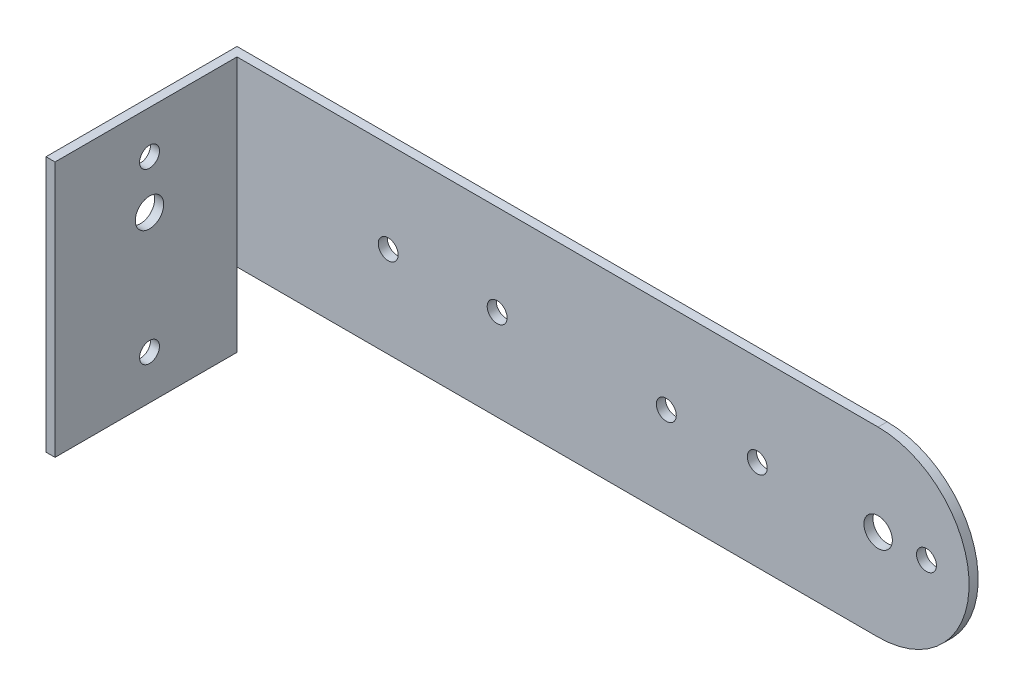
ISO-10303-21;
HEADER;
FILE_DESCRIPTION(('STEP AP214'),'2;1');
FILE_NAME('part.step','',(''),(''),'','','');
FILE_SCHEMA(('AUTOMOTIVE_DESIGN { 1 0 10303 214 1 1 1 1 }'));
ENDSEC;
DATA;
#1=APPLICATION_CONTEXT('core data for automotive mechanical design processes');
#2=APPLICATION_PROTOCOL_DEFINITION('international standard','automotive_design',2000,#1);
#3=PRODUCT_CONTEXT('',#1,'mechanical');
#4=PRODUCT('Part','Part','',(#3));
#5=PRODUCT_RELATED_PRODUCT_CATEGORY('part','',(#4));
#6=PRODUCT_DEFINITION_FORMATION('','',#4);
#7=PRODUCT_DEFINITION_CONTEXT('part definition',#1,'design');
#8=PRODUCT_DEFINITION('design','',#6,#7);
#9=PRODUCT_DEFINITION_SHAPE('','',#8);
#10=(LENGTH_UNIT() NAMED_UNIT(*) SI_UNIT(.MILLI.,.METRE.));
#11=(NAMED_UNIT(*) PLANE_ANGLE_UNIT() SI_UNIT($,.RADIAN.));
#12=(NAMED_UNIT(*) SI_UNIT($,.STERADIAN.) SOLID_ANGLE_UNIT());
#13=UNCERTAINTY_MEASURE_WITH_UNIT(LENGTH_MEASURE(1.E-05),#10,'distance_accuracy_value','');
#14=(GEOMETRIC_REPRESENTATION_CONTEXT(3) GLOBAL_UNCERTAINTY_ASSIGNED_CONTEXT((#13)) GLOBAL_UNIT_ASSIGNED_CONTEXT((#10,
#11,#12)) REPRESENTATION_CONTEXT('',''));
#15=CARTESIAN_POINT('',(0.,0.,0.));
#16=DIRECTION('',(0.,0.,1.));
#17=DIRECTION('',(1.,0.,0.));
#18=AXIS2_PLACEMENT_3D('',#15,#16,#17);
#19=CARTESIAN_POINT('',(0.,0.,1.59));
#20=DIRECTION('',(0.,0.,-1.));
#21=DIRECTION('',(-1.,0.,0.));
#22=AXIS2_PLACEMENT_3D('',#19,#20,#21);
#23=CYLINDRICAL_SURFACE('',#22,16.);
#24=CARTESIAN_POINT('',(0.,0.,0.));
#25=DIRECTION('',(0.,0.,1.));
#26=DIRECTION('',(1.,0.,0.));
#27=AXIS2_PLACEMENT_3D('',#24,#25,#26);
#28=CIRCLE('',#27,16.);
#29=CARTESIAN_POINT('',(0.,-16.,0.));
#30=VERTEX_POINT('',#29);
#31=CARTESIAN_POINT('',(0.,16.,0.));
#32=VERTEX_POINT('',#31);
#33=EDGE_CURVE('E140',#30,#32,#28,.T.);
#34=ORIENTED_EDGE('',*,*,#33,.T.);
#35=DIRECTION('',(0.,0.,-1.));
#36=VECTOR('',#35,1.);
#37=CARTESIAN_POINT('',(0.,16.,1.59));
#38=LINE('',#37,#36);
#39=CARTESIAN_POINT('',(0.,16.,1.59));
#40=VERTEX_POINT('',#39);
#41=EDGE_CURVE('E54',#40,#32,#38,.T.);
#42=ORIENTED_EDGE('',*,*,#41,.F.);
#43=CARTESIAN_POINT('',(0.,0.,1.59));
#44=DIRECTION('',(0.,0.,1.));
#45=DIRECTION('',(1.,0.,0.));
#46=AXIS2_PLACEMENT_3D('',#43,#44,#45);
#47=CIRCLE('',#46,16.);
#48=CARTESIAN_POINT('',(0.,-16.,1.59));
#49=VERTEX_POINT('',#48);
#50=EDGE_CURVE('E149',#49,#40,#47,.T.);
#51=ORIENTED_EDGE('',*,*,#50,.F.);
#52=DIRECTION('',(0.,0.,-1.));
#53=VECTOR('',#52,1.);
#54=CARTESIAN_POINT('',(0.,-16.,1.59));
#55=LINE('',#54,#53);
#56=EDGE_CURVE('E154',#49,#30,#55,.T.);
#57=ORIENTED_EDGE('',*,*,#56,.T.);
#58=EDGE_LOOP('',(#34,#42,#51,#57));
#59=FACE_BOUND('',#58,.T.);
#60=ADVANCED_FACE('F46',(#59),#23,.T.);
#61=CARTESIAN_POINT('',(0.,16.,1.59));
#62=DIRECTION('',(0.,-1.,0.));
#63=DIRECTION('',(0.,0.,-1.));
#64=AXIS2_PLACEMENT_3D('',#61,#62,#63);
#65=PLANE('',#64);
#66=DIRECTION('',(-1.,0.,0.));
#67=VECTOR('',#66,1.);
#68=CARTESIAN_POINT('',(0.,16.,0.));
#69=LINE('',#68,#67);
#70=CARTESIAN_POINT('',(-114.34,16.,0.));
#71=VERTEX_POINT('',#70);
#72=EDGE_CURVE('E143',#32,#71,#69,.T.);
#73=ORIENTED_EDGE('',*,*,#72,.T.);
#74=DIRECTION('',(0.,0.,-1.));
#75=VECTOR('',#74,1.);
#76=CARTESIAN_POINT('',(-114.34,16.,1.59));
#77=LINE('',#76,#75);
#78=CARTESIAN_POINT('',(-114.34,16.,33.59));
#79=VERTEX_POINT('',#78);
#80=EDGE_CURVE('E163',#79,#71,#77,.T.);
#81=ORIENTED_EDGE('',*,*,#80,.F.);
#82=DIRECTION('',(-1.,0.,0.));
#83=VECTOR('',#82,1.);
#84=CARTESIAN_POINT('',(-114.34,16.,33.59));
#85=LINE('',#84,#83);
#86=CARTESIAN_POINT('',(-112.75,16.,33.59));
#87=VERTEX_POINT('',#86);
#88=EDGE_CURVE('E132',#87,#79,#85,.T.);
#89=ORIENTED_EDGE('',*,*,#88,.F.);
#90=DIRECTION('',(0.,0.,-1.));
#91=VECTOR('',#90,1.);
#92=CARTESIAN_POINT('',(-112.75,16.,33.59));
#93=LINE('',#92,#91);
#94=CARTESIAN_POINT('',(-112.75,16.,1.59));
#95=VERTEX_POINT('',#94);
#96=EDGE_CURVE('E145',#87,#95,#93,.T.);
#97=ORIENTED_EDGE('',*,*,#96,.T.);
#98=DIRECTION('',(-1.,0.,0.));
#99=VECTOR('',#98,1.);
#100=CARTESIAN_POINT('',(0.,16.,1.59));
#101=LINE('',#100,#99);
#102=EDGE_CURVE('E93',#40,#95,#101,.T.);
#103=ORIENTED_EDGE('',*,*,#102,.F.);
#104=ORIENTED_EDGE('',*,*,#41,.T.);
#105=EDGE_LOOP('',(#73,#81,#89,#97,#103,#104));
#106=FACE_BOUND('',#105,.T.);
#107=ADVANCED_FACE('F227',(#106),#65,.F.);
#108=CARTESIAN_POINT('',(-114.34,16.,1.59));
#109=DIRECTION('',(1.,0.,0.));
#110=DIRECTION('',(0.,0.,-1.));
#111=AXIS2_PLACEMENT_3D('',#108,#109,#110);
#112=PLANE('',#111);
#113=CARTESIAN_POINT('',(-114.34,8.5,16.975));
#114=DIRECTION('',(-1.,0.,0.));
#115=DIRECTION('',(0.,0.,1.));
#116=AXIS2_PLACEMENT_3D('',#113,#114,#115);
#117=CIRCLE('',#116,1.75);
#118=CARTESIAN_POINT('',(-114.34,8.5,18.725));
#119=VERTEX_POINT('',#118);
#120=EDGE_CURVE('E172',#119,#119,#117,.T.);
#121=ORIENTED_EDGE('',*,*,#120,.F.);
#122=EDGE_LOOP('',(#121));
#123=FACE_BOUND('',#122,.T.);
#124=CARTESIAN_POINT('',(-114.34,-21.25,16.975));
#125=DIRECTION('',(-1.,0.,0.));
#126=DIRECTION('',(0.,0.,1.));
#127=AXIS2_PLACEMENT_3D('',#124,#125,#126);
#128=CIRCLE('',#127,1.75);
#129=CARTESIAN_POINT('',(-114.34,-21.25,18.725));
#130=VERTEX_POINT('',#129);
#131=EDGE_CURVE('E177',#130,#130,#128,.T.);
#132=ORIENTED_EDGE('',*,*,#131,.F.);
#133=EDGE_LOOP('',(#132));
#134=FACE_BOUND('',#133,.T.);
#135=CARTESIAN_POINT('',(-114.34,0.,16.975));
#136=DIRECTION('',(-1.,0.,0.));
#137=DIRECTION('',(0.,0.,1.));
#138=AXIS2_PLACEMENT_3D('',#135,#136,#137);
#139=CIRCLE('',#138,2.5);
#140=CARTESIAN_POINT('',(-114.34,0.,19.475));
#141=VERTEX_POINT('',#140);
#142=EDGE_CURVE('E169',#141,#141,#139,.T.);
#143=ORIENTED_EDGE('',*,*,#142,.F.);
#144=EDGE_LOOP('',(#143));
#145=FACE_BOUND('',#144,.T.);
#146=DIRECTION('',(0.,-1.,0.));
#147=VECTOR('',#146,1.);
#148=CARTESIAN_POINT('',(-114.34,16.,0.));
#149=LINE('',#148,#147);
#150=CARTESIAN_POINT('',(-114.34,-16.,0.));
#151=VERTEX_POINT('',#150);
#152=EDGE_CURVE('E157',#71,#151,#149,.T.);
#153=ORIENTED_EDGE('',*,*,#152,.T.);
#154=DIRECTION('',(0.,0.,-1.));
#155=VECTOR('',#154,1.);
#156=CARTESIAN_POINT('',(-114.34,-16.,1.59));
#157=LINE('',#156,#155);
#158=CARTESIAN_POINT('',(-114.34,-16.,1.59));
#159=VERTEX_POINT('',#158);
#160=EDGE_CURVE('E161',#159,#151,#157,.T.);
#161=ORIENTED_EDGE('',*,*,#160,.F.);
#162=DIRECTION('',(0.,-1.,0.));
#163=VECTOR('',#162,1.);
#164=CARTESIAN_POINT('',(-114.34,16.,1.59));
#165=LINE('',#164,#163);
#166=CARTESIAN_POINT('',(-114.34,-29.,1.59));
#167=VERTEX_POINT('',#166);
#168=EDGE_CURVE('E138',#159,#167,#165,.T.);
#169=ORIENTED_EDGE('',*,*,#168,.T.);
#170=DIRECTION('',(0.,0.,-1.));
#171=VECTOR('',#170,1.);
#172=CARTESIAN_POINT('',(-114.34,-29.,33.59));
#173=LINE('',#172,#171);
#174=CARTESIAN_POINT('',(-114.34,-29.,33.59));
#175=VERTEX_POINT('',#174);
#176=EDGE_CURVE('E120',#175,#167,#173,.T.);
#177=ORIENTED_EDGE('',*,*,#176,.F.);
#178=DIRECTION('',(0.,-1.,0.));
#179=VECTOR('',#178,1.);
#180=CARTESIAN_POINT('',(-114.34,16.,33.59));
#181=LINE('',#180,#179);
#182=EDGE_CURVE('E126',#79,#175,#181,.T.);
#183=ORIENTED_EDGE('',*,*,#182,.F.);
#184=ORIENTED_EDGE('',*,*,#80,.T.);
#185=EDGE_LOOP('',(#153,#161,#169,#177,#183,#184));
#186=FACE_BOUND('',#185,.T.);
#187=ADVANCED_FACE('F136',(#123,#134,#145,#186),#112,.F.);
#188=CARTESIAN_POINT('',(-114.34,-16.,1.59));
#189=DIRECTION('',(0.,1.,0.));
#190=DIRECTION('',(0.,0.,1.));
#191=AXIS2_PLACEMENT_3D('',#188,#189,#190);
#192=PLANE('',#191);
#193=DIRECTION('',(1.,0.,0.));
#194=VECTOR('',#193,1.);
#195=CARTESIAN_POINT('',(-114.34,-16.,0.));
#196=LINE('',#195,#194);
#197=EDGE_CURVE('E87',#151,#30,#196,.T.);
#198=ORIENTED_EDGE('',*,*,#197,.T.);
#199=ORIENTED_EDGE('',*,*,#56,.F.);
#200=DIRECTION('',(1.,0.,0.));
#201=VECTOR('',#200,1.);
#202=CARTESIAN_POINT('',(-114.34,-16.,1.59));
#203=LINE('',#202,#201);
#204=CARTESIAN_POINT('',(-112.75,-16.,1.59));
#205=VERTEX_POINT('',#204);
#206=EDGE_CURVE('E66',#205,#49,#203,.T.);
#207=ORIENTED_EDGE('',*,*,#206,.F.);
#208=EDGE_CURVE('E152',#159,#205,#203,.T.);
#209=ORIENTED_EDGE('',*,*,#208,.F.);
#210=ORIENTED_EDGE('',*,*,#160,.T.);
#211=EDGE_LOOP('',(#198,#199,#207,#209,#210));
#212=FACE_BOUND('',#211,.T.);
#213=ADVANCED_FACE('F234',(#212),#192,.F.);
#214=CARTESIAN_POINT('',(0.,0.,1.59));
#215=DIRECTION('',(0.,0.,1.));
#216=DIRECTION('',(1.,0.,0.));
#217=AXIS2_PLACEMENT_3D('',#214,#215,#216);
#218=PLANE('',#217);
#219=CARTESIAN_POINT('',(8.5,0.,1.59));
#220=DIRECTION('',(0.,0.,1.));
#221=DIRECTION('',(1.,0.,0.));
#222=AXIS2_PLACEMENT_3D('',#219,#220,#221);
#223=CIRCLE('',#222,1.75);
#224=CARTESIAN_POINT('',(10.25,0.,1.59));
#225=VERTEX_POINT('',#224);
#226=EDGE_CURVE('E190',#225,#225,#223,.T.);
#227=ORIENTED_EDGE('',*,*,#226,.F.);
#228=EDGE_LOOP('',(#227));
#229=FACE_BOUND('',#228,.T.);
#230=CARTESIAN_POINT('',(-21.25,0.,1.59));
#231=DIRECTION('',(0.,0.,1.));
#232=DIRECTION('',(1.,0.,0.));
#233=AXIS2_PLACEMENT_3D('',#230,#231,#232);
#234=CIRCLE('',#233,1.75);
#235=CARTESIAN_POINT('',(-19.5,0.,1.59));
#236=VERTEX_POINT('',#235);
#237=EDGE_CURVE('E196',#236,#236,#234,.T.);
#238=ORIENTED_EDGE('',*,*,#237,.F.);
#239=EDGE_LOOP('',(#238));
#240=FACE_BOUND('',#239,.T.);
#241=CARTESIAN_POINT('',(-37.25,0.,1.59));
#242=DIRECTION('',(0.,0.,1.));
#243=DIRECTION('',(1.,0.,0.));
#244=AXIS2_PLACEMENT_3D('',#241,#242,#243);
#245=CIRCLE('',#244,1.75);
#246=CARTESIAN_POINT('',(-35.5,0.,1.59));
#247=VERTEX_POINT('',#246);
#248=EDGE_CURVE('E202',#247,#247,#245,.T.);
#249=ORIENTED_EDGE('',*,*,#248,.F.);
#250=EDGE_LOOP('',(#249));
#251=FACE_BOUND('',#250,.T.);
#252=CARTESIAN_POINT('',(-67.,0.,1.59));
#253=DIRECTION('',(0.,0.,1.));
#254=DIRECTION('',(1.,0.,0.));
#255=AXIS2_PLACEMENT_3D('',#252,#253,#254);
#256=CIRCLE('',#255,1.75);
#257=CARTESIAN_POINT('',(-65.25,0.,1.59));
#258=VERTEX_POINT('',#257);
#259=EDGE_CURVE('E208',#258,#258,#256,.T.);
#260=ORIENTED_EDGE('',*,*,#259,.F.);
#261=EDGE_LOOP('',(#260));
#262=FACE_BOUND('',#261,.T.);
#263=CARTESIAN_POINT('',(-86.16,0.,1.59));
#264=DIRECTION('',(0.,0.,1.));
#265=DIRECTION('',(1.,0.,0.));
#266=AXIS2_PLACEMENT_3D('',#263,#264,#265);
#267=CIRCLE('',#266,1.75);
#268=CARTESIAN_POINT('',(-84.41,0.,1.59));
#269=VERTEX_POINT('',#268);
#270=EDGE_CURVE('E168',#269,#269,#267,.T.);
#271=ORIENTED_EDGE('',*,*,#270,.F.);
#272=EDGE_LOOP('',(#271));
#273=FACE_BOUND('',#272,.T.);
#274=CARTESIAN_POINT('',(0.,0.,1.59));
#275=DIRECTION('',(0.,0.,1.));
#276=DIRECTION('',(1.,0.,0.));
#277=AXIS2_PLACEMENT_3D('',#274,#275,#276);
#278=CIRCLE('',#277,2.5);
#279=CARTESIAN_POINT('',(2.5,0.,1.59));
#280=VERTEX_POINT('',#279);
#281=EDGE_CURVE('E189',#280,#280,#278,.T.);
#282=ORIENTED_EDGE('',*,*,#281,.F.);
#283=EDGE_LOOP('',(#282));
#284=FACE_BOUND('',#283,.T.);
#285=DIRECTION('',(0.,1.,0.));
#286=VECTOR('',#285,1.);
#287=CARTESIAN_POINT('',(-112.75,16.,1.59));
#288=LINE('',#287,#286);
#289=EDGE_CURVE('E13',#205,#95,#288,.T.);
#290=ORIENTED_EDGE('',*,*,#289,.F.);
#291=ORIENTED_EDGE('',*,*,#206,.T.);
#292=ORIENTED_EDGE('',*,*,#50,.T.);
#293=ORIENTED_EDGE('',*,*,#102,.T.);
#294=EDGE_LOOP('',(#290,#291,#292,#293));
#295=FACE_BOUND('',#294,.T.);
#296=ADVANCED_FACE('F239',(#229,#240,#251,#262,#273,#284,#295),#218,.T.);
#297=CARTESIAN_POINT('',(0.,0.,0.));
#298=DIRECTION('',(0.,0.,1.));
#299=DIRECTION('',(1.,0.,0.));
#300=AXIS2_PLACEMENT_3D('',#297,#298,#299);
#301=PLANE('',#300);
#302=CARTESIAN_POINT('',(8.5,0.,0.));
#303=DIRECTION('',(0.,0.,1.));
#304=DIRECTION('',(1.,0.,0.));
#305=AXIS2_PLACEMENT_3D('',#302,#303,#304);
#306=CIRCLE('',#305,1.75);
#307=CARTESIAN_POINT('',(10.25,0.,0.));
#308=VERTEX_POINT('',#307);
#309=EDGE_CURVE('E186',#308,#308,#306,.T.);
#310=ORIENTED_EDGE('',*,*,#309,.T.);
#311=EDGE_LOOP('',(#310));
#312=FACE_BOUND('',#311,.T.);
#313=CARTESIAN_POINT('',(-21.25,0.,0.));
#314=DIRECTION('',(0.,0.,1.));
#315=DIRECTION('',(1.,0.,0.));
#316=AXIS2_PLACEMENT_3D('',#313,#314,#315);
#317=CIRCLE('',#316,1.75);
#318=CARTESIAN_POINT('',(-19.5,0.,0.));
#319=VERTEX_POINT('',#318);
#320=EDGE_CURVE('E193',#319,#319,#317,.T.);
#321=ORIENTED_EDGE('',*,*,#320,.T.);
#322=EDGE_LOOP('',(#321));
#323=FACE_BOUND('',#322,.T.);
#324=CARTESIAN_POINT('',(-37.25,0.,0.));
#325=DIRECTION('',(0.,0.,1.));
#326=DIRECTION('',(1.,0.,0.));
#327=AXIS2_PLACEMENT_3D('',#324,#325,#326);
#328=CIRCLE('',#327,1.75);
#329=CARTESIAN_POINT('',(-35.5,0.,0.));
#330=VERTEX_POINT('',#329);
#331=EDGE_CURVE('E199',#330,#330,#328,.T.);
#332=ORIENTED_EDGE('',*,*,#331,.T.);
#333=EDGE_LOOP('',(#332));
#334=FACE_BOUND('',#333,.T.);
#335=CARTESIAN_POINT('',(-67.,0.,0.));
#336=DIRECTION('',(0.,0.,1.));
#337=DIRECTION('',(1.,0.,0.));
#338=AXIS2_PLACEMENT_3D('',#335,#336,#337);
#339=CIRCLE('',#338,1.75);
#340=CARTESIAN_POINT('',(-65.25,0.,0.));
#341=VERTEX_POINT('',#340);
#342=EDGE_CURVE('E205',#341,#341,#339,.T.);
#343=ORIENTED_EDGE('',*,*,#342,.T.);
#344=EDGE_LOOP('',(#343));
#345=FACE_BOUND('',#344,.T.);
#346=CARTESIAN_POINT('',(-86.16,0.,0.));
#347=DIRECTION('',(0.,0.,1.));
#348=DIRECTION('',(1.,0.,0.));
#349=AXIS2_PLACEMENT_3D('',#346,#347,#348);
#350=CIRCLE('',#349,1.75);
#351=CARTESIAN_POINT('',(-84.41,0.,0.));
#352=VERTEX_POINT('',#351);
#353=EDGE_CURVE('E211',#352,#352,#350,.T.);
#354=ORIENTED_EDGE('',*,*,#353,.T.);
#355=EDGE_LOOP('',(#354));
#356=FACE_BOUND('',#355,.T.);
#357=CARTESIAN_POINT('',(0.,0.,0.));
#358=DIRECTION('',(0.,0.,1.));
#359=DIRECTION('',(1.,0.,0.));
#360=AXIS2_PLACEMENT_3D('',#357,#358,#359);
#361=CIRCLE('',#360,2.5);
#362=CARTESIAN_POINT('',(2.5,0.,0.));
#363=VERTEX_POINT('',#362);
#364=EDGE_CURVE('E216',#363,#363,#361,.T.);
#365=ORIENTED_EDGE('',*,*,#364,.T.);
#366=EDGE_LOOP('',(#365));
#367=FACE_BOUND('',#366,.T.);
#368=ORIENTED_EDGE('',*,*,#33,.F.);
#369=ORIENTED_EDGE('',*,*,#197,.F.);
#370=ORIENTED_EDGE('',*,*,#152,.F.);
#371=ORIENTED_EDGE('',*,*,#72,.F.);
#372=EDGE_LOOP('',(#368,#369,#370,#371));
#373=FACE_BOUND('',#372,.T.);
#374=ADVANCED_FACE('F241',(#312,#323,#334,#345,#356,#367,#373),#301,.F.);
#375=CARTESIAN_POINT('',(0.,0.,1.59));
#376=DIRECTION('',(0.,0.,1.));
#377=DIRECTION('',(1.,0.,0.));
#378=AXIS2_PLACEMENT_3D('',#375,#376,#377);
#379=PLANE('',#378);
#380=ORIENTED_EDGE('',*,*,#168,.F.);
#381=ORIENTED_EDGE('',*,*,#208,.T.);
#382=CARTESIAN_POINT('',(-112.75,-29.,1.59));
#383=VERTEX_POINT('',#382);
#384=EDGE_CURVE('E56',#383,#205,#288,.T.);
#385=ORIENTED_EDGE('',*,*,#384,.F.);
#386=DIRECTION('',(1.,0.,0.));
#387=VECTOR('',#386,1.);
#388=CARTESIAN_POINT('',(-114.34,-29.,1.59));
#389=LINE('',#388,#387);
#390=EDGE_CURVE('E224',#167,#383,#389,.T.);
#391=ORIENTED_EDGE('',*,*,#390,.F.);
#392=EDGE_LOOP('',(#380,#381,#385,#391));
#393=FACE_BOUND('',#392,.T.);
#394=ADVANCED_FACE('F232',(#393),#379,.F.);
#395=CARTESIAN_POINT('',(-114.34,-29.,33.59));
#396=DIRECTION('',(0.,1.,0.));
#397=DIRECTION('',(0.,0.,1.));
#398=AXIS2_PLACEMENT_3D('',#395,#396,#397);
#399=PLANE('',#398);
#400=ORIENTED_EDGE('',*,*,#390,.T.);
#401=DIRECTION('',(0.,0.,-1.));
#402=VECTOR('',#401,1.);
#403=CARTESIAN_POINT('',(-112.75,-29.,33.59));
#404=LINE('',#403,#402);
#405=CARTESIAN_POINT('',(-112.75,-29.,33.59));
#406=VERTEX_POINT('',#405);
#407=EDGE_CURVE('E122',#406,#383,#404,.T.);
#408=ORIENTED_EDGE('',*,*,#407,.F.);
#409=DIRECTION('',(1.,0.,0.));
#410=VECTOR('',#409,1.);
#411=CARTESIAN_POINT('',(-114.34,-29.,33.59));
#412=LINE('',#411,#410);
#413=EDGE_CURVE('E116',#175,#406,#412,.T.);
#414=ORIENTED_EDGE('',*,*,#413,.F.);
#415=ORIENTED_EDGE('',*,*,#176,.T.);
#416=EDGE_LOOP('',(#400,#408,#414,#415));
#417=FACE_BOUND('',#416,.T.);
#418=ADVANCED_FACE('F118',(#417),#399,.F.);
#419=CARTESIAN_POINT('',(-112.75,16.,33.59));
#420=DIRECTION('',(-1.,0.,0.));
#421=DIRECTION('',(0.,0.,1.));
#422=AXIS2_PLACEMENT_3D('',#419,#420,#421);
#423=PLANE('',#422);
#424=CARTESIAN_POINT('',(-112.75,8.5,16.975));
#425=DIRECTION('',(-1.,0.,0.));
#426=DIRECTION('',(0.,0.,1.));
#427=AXIS2_PLACEMENT_3D('',#424,#425,#426);
#428=CIRCLE('',#427,1.75);
#429=CARTESIAN_POINT('',(-112.75,8.5,18.725));
#430=VERTEX_POINT('',#429);
#431=EDGE_CURVE('E49',#430,#430,#428,.T.);
#432=ORIENTED_EDGE('',*,*,#431,.T.);
#433=EDGE_LOOP('',(#432));
#434=FACE_BOUND('',#433,.T.);
#435=CARTESIAN_POINT('',(-112.75,-21.25,16.975));
#436=DIRECTION('',(-1.,0.,0.));
#437=DIRECTION('',(0.,0.,1.));
#438=AXIS2_PLACEMENT_3D('',#435,#436,#437);
#439=CIRCLE('',#438,1.75);
#440=CARTESIAN_POINT('',(-112.75,-21.25,18.725));
#441=VERTEX_POINT('',#440);
#442=EDGE_CURVE('E170',#441,#441,#439,.T.);
#443=ORIENTED_EDGE('',*,*,#442,.T.);
#444=EDGE_LOOP('',(#443));
#445=FACE_BOUND('',#444,.T.);
#446=CARTESIAN_POINT('',(-112.75,0.,16.975));
#447=DIRECTION('',(-1.,0.,0.));
#448=DIRECTION('',(0.,0.,1.));
#449=AXIS2_PLACEMENT_3D('',#446,#447,#448);
#450=CIRCLE('',#449,2.5);
#451=CARTESIAN_POINT('',(-112.75,0.,19.475));
#452=VERTEX_POINT('',#451);
#453=EDGE_CURVE('E166',#452,#452,#450,.T.);
#454=ORIENTED_EDGE('',*,*,#453,.T.);
#455=EDGE_LOOP('',(#454));
#456=FACE_BOUND('',#455,.T.);
#457=ORIENTED_EDGE('',*,*,#384,.T.);
#458=ORIENTED_EDGE('',*,*,#289,.T.);
#459=ORIENTED_EDGE('',*,*,#96,.F.);
#460=DIRECTION('',(0.,1.,0.));
#461=VECTOR('',#460,1.);
#462=CARTESIAN_POINT('',(-112.75,16.,33.59));
#463=LINE('',#462,#461);
#464=EDGE_CURVE('E125',#406,#87,#463,.T.);
#465=ORIENTED_EDGE('',*,*,#464,.F.);
#466=ORIENTED_EDGE('',*,*,#407,.T.);
#467=EDGE_LOOP('',(#457,#458,#459,#465,#466));
#468=FACE_BOUND('',#467,.T.);
#469=ADVANCED_FACE('F229',(#434,#445,#456,#468),#423,.F.);
#470=CARTESIAN_POINT('',(0.,0.,33.59));
#471=DIRECTION('',(0.,0.,1.));
#472=DIRECTION('',(1.,0.,0.));
#473=AXIS2_PLACEMENT_3D('',#470,#471,#472);
#474=PLANE('',#473);
#475=ORIENTED_EDGE('',*,*,#182,.T.);
#476=ORIENTED_EDGE('',*,*,#413,.T.);
#477=ORIENTED_EDGE('',*,*,#464,.T.);
#478=ORIENTED_EDGE('',*,*,#88,.T.);
#479=EDGE_LOOP('',(#475,#476,#477,#478));
#480=FACE_BOUND('',#479,.T.);
#481=ADVANCED_FACE('F130',(#480),#474,.T.);
#482=CARTESIAN_POINT('',(0.,0.,0.));
#483=DIRECTION('',(0.,0.,1.));
#484=DIRECTION('',(1.,0.,0.));
#485=AXIS2_PLACEMENT_3D('',#482,#483,#484);
#486=CYLINDRICAL_SURFACE('',#485,2.5);
#487=CARTESIAN_POINT('',(2.5,0.,0.));
#488=CARTESIAN_POINT('',(2.5,0.,0.0165625));
#489=CARTESIAN_POINT('',(2.5,0.,0.033125));
#490=CARTESIAN_POINT('',(2.5,0.,0.06625));
#491=CARTESIAN_POINT('',(2.5,0.,0.0828125));
#492=CARTESIAN_POINT('',(2.5,0.,0.1159375));
#493=CARTESIAN_POINT('',(2.5,0.,0.1325));
#494=CARTESIAN_POINT('',(2.5,0.,0.165625));
#495=CARTESIAN_POINT('',(2.5,0.,0.1821875));
#496=CARTESIAN_POINT('',(2.5,0.,0.2153125));
#497=CARTESIAN_POINT('',(2.5,0.,0.231875));
#498=CARTESIAN_POINT('',(2.5,0.,0.265));
#499=CARTESIAN_POINT('',(2.5,0.,0.2815625));
#500=CARTESIAN_POINT('',(2.5,0.,0.3146875));
#501=CARTESIAN_POINT('',(2.5,0.,0.33125));
#502=CARTESIAN_POINT('',(2.5,0.,0.364375));
#503=CARTESIAN_POINT('',(2.5,0.,0.3809375));
#504=CARTESIAN_POINT('',(2.5,0.,0.4140625));
#505=CARTESIAN_POINT('',(2.5,0.,0.430625));
#506=CARTESIAN_POINT('',(2.5,0.,0.46375));
#507=CARTESIAN_POINT('',(2.5,0.,0.4803125));
#508=CARTESIAN_POINT('',(2.5,0.,0.5134375));
#509=CARTESIAN_POINT('',(2.5,0.,0.53));
#510=CARTESIAN_POINT('',(2.5,0.,0.563125));
#511=CARTESIAN_POINT('',(2.5,0.,0.5796875));
#512=CARTESIAN_POINT('',(2.5,0.,0.6128125));
#513=CARTESIAN_POINT('',(2.5,0.,0.629375));
#514=CARTESIAN_POINT('',(2.5,0.,0.6625));
#515=CARTESIAN_POINT('',(2.5,0.,0.6790625));
#516=CARTESIAN_POINT('',(2.5,0.,0.7121875));
#517=CARTESIAN_POINT('',(2.5,0.,0.72875));
#518=CARTESIAN_POINT('',(2.5,0.,0.761875));
#519=CARTESIAN_POINT('',(2.5,0.,0.7784375));
#520=CARTESIAN_POINT('',(2.5,0.,0.8115625));
#521=CARTESIAN_POINT('',(2.5,0.,0.828125));
#522=CARTESIAN_POINT('',(2.5,0.,0.86125));
#523=CARTESIAN_POINT('',(2.5,0.,0.8778125));
#524=CARTESIAN_POINT('',(2.5,0.,0.9109375));
#525=CARTESIAN_POINT('',(2.5,0.,0.9275));
#526=CARTESIAN_POINT('',(2.5,0.,0.960625));
#527=CARTESIAN_POINT('',(2.5,0.,0.9771875));
#528=CARTESIAN_POINT('',(2.5,0.,1.0103125));
#529=CARTESIAN_POINT('',(2.5,0.,1.026875));
#530=CARTESIAN_POINT('',(2.5,0.,1.06));
#531=CARTESIAN_POINT('',(2.5,0.,1.0765625));
#532=CARTESIAN_POINT('',(2.5,0.,1.1096875));
#533=CARTESIAN_POINT('',(2.5,0.,1.12625));
#534=CARTESIAN_POINT('',(2.5,0.,1.159375));
#535=CARTESIAN_POINT('',(2.5,0.,1.1759375));
#536=CARTESIAN_POINT('',(2.5,0.,1.2090625));
#537=CARTESIAN_POINT('',(2.5,0.,1.225625));
#538=CARTESIAN_POINT('',(2.5,0.,1.25875));
#539=CARTESIAN_POINT('',(2.5,0.,1.2753125));
#540=CARTESIAN_POINT('',(2.5,0.,1.3084375));
#541=CARTESIAN_POINT('',(2.5,0.,1.325));
#542=CARTESIAN_POINT('',(2.5,0.,1.358125));
#543=CARTESIAN_POINT('',(2.5,0.,1.3746875));
#544=CARTESIAN_POINT('',(2.5,0.,1.4078125));
#545=CARTESIAN_POINT('',(2.5,0.,1.424375));
#546=CARTESIAN_POINT('',(2.5,0.,1.4575));
#547=CARTESIAN_POINT('',(2.5,0.,1.4740625));
#548=CARTESIAN_POINT('',(2.5,0.,1.5071875));
#549=CARTESIAN_POINT('',(2.5,0.,1.52375));
#550=CARTESIAN_POINT('',(2.5,0.,1.556875));
#551=CARTESIAN_POINT('',(2.5,0.,1.5734375));
#552=CARTESIAN_POINT('',(2.5,0.,1.59));
#553=B_SPLINE_CURVE_WITH_KNOTS('',3,(#487,#488,#489,#490,#491,#492,#493,#494,#495,#496,#497,
#498,#499,#500,#501,#502,#503,#504,#505,#506,#507,#508,#509,#510,#511,#512,#513,#514,#515,#516,
#517,#518,#519,#520,#521,#522,#523,#524,#525,#526,#527,#528,#529,#530,#531,#532,#533,#534,#535,
#536,#537,#538,#539,#540,#541,#542,#543,#544,#545,#546,#547,#548,#549,#550,#551,#552),
.UNSPECIFIED.,.F.,.F.,(4,2,2,2,2,2,2,2,2,2,2,2,2,2,2,2,2,2,2,2,2,2,2,2,2,2,2,2,2,2,2,2,4),(0.,
0.0496875,0.099375,0.1490625,0.19875,0.2484375,0.298125,0.3478125,0.3975,0.4471875,0.496875,
0.5465625,0.59625,0.6459375,0.695625,0.7453125,0.795,0.8446875,0.894375,0.9440625,0.99375,
1.0434375,1.093125,1.1428125,1.1925,1.2421875,1.291875,1.3415625,1.39125,1.4409375,1.490625,
1.5403125,1.59),.UNSPECIFIED.);
#554=EDGE_CURVE('BSEAM285',#363,#280,#553,.T.);
#555=ORIENTED_EDGE('',*,*,#364,.F.);
#556=ORIENTED_EDGE('',*,*,#281,.T.);
#557=ORIENTED_EDGE('',*,*,#554,.T.);
#558=ORIENTED_EDGE('',*,*,#554,.F.);
#559=EDGE_LOOP('',(#555,#557,#556,#558));
#560=FACE_BOUND('',#559,.T.);
#561=ADVANCED_FACE('F285',(#560),#486,.F.);
#562=CARTESIAN_POINT('',(-86.16,0.,0.));
#563=DIRECTION('',(0.,0.,1.));
#564=DIRECTION('',(1.,0.,0.));
#565=AXIS2_PLACEMENT_3D('',#562,#563,#564);
#566=CYLINDRICAL_SURFACE('',#565,1.75);
#567=CARTESIAN_POINT('',(-84.41,0.,0.));
#568=CARTESIAN_POINT('',(-84.41,0.,0.0165625));
#569=CARTESIAN_POINT('',(-84.41,0.,0.033125));
#570=CARTESIAN_POINT('',(-84.41,0.,0.06625));
#571=CARTESIAN_POINT('',(-84.41,0.,0.0828125));
#572=CARTESIAN_POINT('',(-84.41,0.,0.1159375));
#573=CARTESIAN_POINT('',(-84.41,0.,0.1325));
#574=CARTESIAN_POINT('',(-84.41,0.,0.165625));
#575=CARTESIAN_POINT('',(-84.41,0.,0.1821875));
#576=CARTESIAN_POINT('',(-84.41,0.,0.2153125));
#577=CARTESIAN_POINT('',(-84.41,0.,0.231875));
#578=CARTESIAN_POINT('',(-84.41,0.,0.265));
#579=CARTESIAN_POINT('',(-84.41,0.,0.2815625));
#580=CARTESIAN_POINT('',(-84.41,0.,0.3146875));
#581=CARTESIAN_POINT('',(-84.41,0.,0.33125));
#582=CARTESIAN_POINT('',(-84.41,0.,0.364375));
#583=CARTESIAN_POINT('',(-84.41,0.,0.3809375));
#584=CARTESIAN_POINT('',(-84.41,0.,0.4140625));
#585=CARTESIAN_POINT('',(-84.41,0.,0.430625));
#586=CARTESIAN_POINT('',(-84.41,0.,0.46375));
#587=CARTESIAN_POINT('',(-84.41,0.,0.4803125));
#588=CARTESIAN_POINT('',(-84.41,0.,0.5134375));
#589=CARTESIAN_POINT('',(-84.41,0.,0.53));
#590=CARTESIAN_POINT('',(-84.41,0.,0.563125));
#591=CARTESIAN_POINT('',(-84.41,0.,0.5796875));
#592=CARTESIAN_POINT('',(-84.41,0.,0.6128125));
#593=CARTESIAN_POINT('',(-84.41,0.,0.629375));
#594=CARTESIAN_POINT('',(-84.41,0.,0.6625));
#595=CARTESIAN_POINT('',(-84.41,0.,0.6790625));
#596=CARTESIAN_POINT('',(-84.41,0.,0.7121875));
#597=CARTESIAN_POINT('',(-84.41,0.,0.72875));
#598=CARTESIAN_POINT('',(-84.41,0.,0.761875));
#599=CARTESIAN_POINT('',(-84.41,0.,0.7784375));
#600=CARTESIAN_POINT('',(-84.41,0.,0.8115625));
#601=CARTESIAN_POINT('',(-84.41,0.,0.828125));
#602=CARTESIAN_POINT('',(-84.41,0.,0.86125));
#603=CARTESIAN_POINT('',(-84.41,0.,0.8778125));
#604=CARTESIAN_POINT('',(-84.41,0.,0.9109375));
#605=CARTESIAN_POINT('',(-84.41,0.,0.9275));
#606=CARTESIAN_POINT('',(-84.41,0.,0.960625));
#607=CARTESIAN_POINT('',(-84.41,0.,0.9771875));
#608=CARTESIAN_POINT('',(-84.41,0.,1.0103125));
#609=CARTESIAN_POINT('',(-84.41,0.,1.026875));
#610=CARTESIAN_POINT('',(-84.41,0.,1.06));
#611=CARTESIAN_POINT('',(-84.41,0.,1.0765625));
#612=CARTESIAN_POINT('',(-84.41,0.,1.1096875));
#613=CARTESIAN_POINT('',(-84.41,0.,1.12625));
#614=CARTESIAN_POINT('',(-84.41,0.,1.159375));
#615=CARTESIAN_POINT('',(-84.41,0.,1.1759375));
#616=CARTESIAN_POINT('',(-84.41,0.,1.2090625));
#617=CARTESIAN_POINT('',(-84.41,0.,1.225625));
#618=CARTESIAN_POINT('',(-84.41,0.,1.25875));
#619=CARTESIAN_POINT('',(-84.41,0.,1.2753125));
#620=CARTESIAN_POINT('',(-84.41,0.,1.3084375));
#621=CARTESIAN_POINT('',(-84.41,0.,1.325));
#622=CARTESIAN_POINT('',(-84.41,0.,1.358125));
#623=CARTESIAN_POINT('',(-84.41,0.,1.3746875));
#624=CARTESIAN_POINT('',(-84.41,0.,1.4078125));
#625=CARTESIAN_POINT('',(-84.41,0.,1.424375));
#626=CARTESIAN_POINT('',(-84.41,0.,1.4575));
#627=CARTESIAN_POINT('',(-84.41,0.,1.4740625));
#628=CARTESIAN_POINT('',(-84.41,0.,1.5071875));
#629=CARTESIAN_POINT('',(-84.41,0.,1.52375));
#630=CARTESIAN_POINT('',(-84.41,0.,1.556875));
#631=CARTESIAN_POINT('',(-84.41,0.,1.5734375));
#632=CARTESIAN_POINT('',(-84.41,0.,1.59));
#633=B_SPLINE_CURVE_WITH_KNOTS('',3,(#567,#568,#569,#570,#571,#572,#573,#574,#575,#576,#577,
#578,#579,#580,#581,#582,#583,#584,#585,#586,#587,#588,#589,#590,#591,#592,#593,#594,#595,#596,
#597,#598,#599,#600,#601,#602,#603,#604,#605,#606,#607,#608,#609,#610,#611,#612,#613,#614,#615,
#616,#617,#618,#619,#620,#621,#622,#623,#624,#625,#626,#627,#628,#629,#630,#631,#632),
.UNSPECIFIED.,.F.,.F.,(4,2,2,2,2,2,2,2,2,2,2,2,2,2,2,2,2,2,2,2,2,2,2,2,2,2,2,2,2,2,2,2,4),(0.,
0.0496875,0.099375,0.1490625,0.19875,0.2484375,0.298125,0.3478125,0.3975,0.4471875,0.496875,
0.5465625,0.59625,0.6459375,0.695625,0.7453125,0.795,0.8446875,0.894375,0.9440625,0.99375,
1.0434375,1.093125,1.1428125,1.1925,1.2421875,1.291875,1.3415625,1.39125,1.4409375,1.490625,
1.5403125,1.59),.UNSPECIFIED.);
#634=EDGE_CURVE('BSEAM292',#352,#269,#633,.T.);
#635=ORIENTED_EDGE('',*,*,#353,.F.);
#636=ORIENTED_EDGE('',*,*,#270,.T.);
#637=ORIENTED_EDGE('',*,*,#634,.T.);
#638=ORIENTED_EDGE('',*,*,#634,.F.);
#639=EDGE_LOOP('',(#635,#637,#636,#638));
#640=FACE_BOUND('',#639,.T.);
#641=ADVANCED_FACE('F292',(#640),#566,.F.);
#642=CARTESIAN_POINT('',(-67.,0.,0.));
#643=DIRECTION('',(0.,0.,1.));
#644=DIRECTION('',(1.,0.,0.));
#645=AXIS2_PLACEMENT_3D('',#642,#643,#644);
#646=CYLINDRICAL_SURFACE('',#645,1.75);
#647=CARTESIAN_POINT('',(-65.25,0.,0.));
#648=CARTESIAN_POINT('',(-65.25,0.,0.0165625));
#649=CARTESIAN_POINT('',(-65.25,0.,0.033125));
#650=CARTESIAN_POINT('',(-65.25,0.,0.06625));
#651=CARTESIAN_POINT('',(-65.25,0.,0.0828125));
#652=CARTESIAN_POINT('',(-65.25,0.,0.1159375));
#653=CARTESIAN_POINT('',(-65.25,0.,0.1325));
#654=CARTESIAN_POINT('',(-65.25,0.,0.165625));
#655=CARTESIAN_POINT('',(-65.25,0.,0.1821875));
#656=CARTESIAN_POINT('',(-65.25,0.,0.2153125));
#657=CARTESIAN_POINT('',(-65.25,0.,0.231875));
#658=CARTESIAN_POINT('',(-65.25,0.,0.265));
#659=CARTESIAN_POINT('',(-65.25,0.,0.2815625));
#660=CARTESIAN_POINT('',(-65.25,0.,0.3146875));
#661=CARTESIAN_POINT('',(-65.25,0.,0.33125));
#662=CARTESIAN_POINT('',(-65.25,0.,0.364375));
#663=CARTESIAN_POINT('',(-65.25,0.,0.3809375));
#664=CARTESIAN_POINT('',(-65.25,0.,0.4140625));
#665=CARTESIAN_POINT('',(-65.25,0.,0.430625));
#666=CARTESIAN_POINT('',(-65.25,0.,0.46375));
#667=CARTESIAN_POINT('',(-65.25,0.,0.4803125));
#668=CARTESIAN_POINT('',(-65.25,0.,0.5134375));
#669=CARTESIAN_POINT('',(-65.25,0.,0.53));
#670=CARTESIAN_POINT('',(-65.25,0.,0.563125));
#671=CARTESIAN_POINT('',(-65.25,0.,0.5796875));
#672=CARTESIAN_POINT('',(-65.25,0.,0.6128125));
#673=CARTESIAN_POINT('',(-65.25,0.,0.629375));
#674=CARTESIAN_POINT('',(-65.25,0.,0.6625));
#675=CARTESIAN_POINT('',(-65.25,0.,0.6790625));
#676=CARTESIAN_POINT('',(-65.25,0.,0.7121875));
#677=CARTESIAN_POINT('',(-65.25,0.,0.72875));
#678=CARTESIAN_POINT('',(-65.25,0.,0.761875));
#679=CARTESIAN_POINT('',(-65.25,0.,0.7784375));
#680=CARTESIAN_POINT('',(-65.25,0.,0.8115625));
#681=CARTESIAN_POINT('',(-65.25,0.,0.828125));
#682=CARTESIAN_POINT('',(-65.25,0.,0.86125));
#683=CARTESIAN_POINT('',(-65.25,0.,0.8778125));
#684=CARTESIAN_POINT('',(-65.25,0.,0.9109375));
#685=CARTESIAN_POINT('',(-65.25,0.,0.9275));
#686=CARTESIAN_POINT('',(-65.25,0.,0.960625));
#687=CARTESIAN_POINT('',(-65.25,0.,0.9771875));
#688=CARTESIAN_POINT('',(-65.25,0.,1.0103125));
#689=CARTESIAN_POINT('',(-65.25,0.,1.026875));
#690=CARTESIAN_POINT('',(-65.25,0.,1.06));
#691=CARTESIAN_POINT('',(-65.25,0.,1.0765625));
#692=CARTESIAN_POINT('',(-65.25,0.,1.1096875));
#693=CARTESIAN_POINT('',(-65.25,0.,1.12625));
#694=CARTESIAN_POINT('',(-65.25,0.,1.159375));
#695=CARTESIAN_POINT('',(-65.25,0.,1.1759375));
#696=CARTESIAN_POINT('',(-65.25,0.,1.2090625));
#697=CARTESIAN_POINT('',(-65.25,0.,1.225625));
#698=CARTESIAN_POINT('',(-65.25,0.,1.25875));
#699=CARTESIAN_POINT('',(-65.25,0.,1.2753125));
#700=CARTESIAN_POINT('',(-65.25,0.,1.3084375));
#701=CARTESIAN_POINT('',(-65.25,0.,1.325));
#702=CARTESIAN_POINT('',(-65.25,0.,1.358125));
#703=CARTESIAN_POINT('',(-65.25,0.,1.3746875));
#704=CARTESIAN_POINT('',(-65.25,0.,1.4078125));
#705=CARTESIAN_POINT('',(-65.25,0.,1.424375));
#706=CARTESIAN_POINT('',(-65.25,0.,1.4575));
#707=CARTESIAN_POINT('',(-65.25,0.,1.4740625));
#708=CARTESIAN_POINT('',(-65.25,0.,1.5071875));
#709=CARTESIAN_POINT('',(-65.25,0.,1.52375));
#710=CARTESIAN_POINT('',(-65.25,0.,1.556875));
#711=CARTESIAN_POINT('',(-65.25,0.,1.5734375));
#712=CARTESIAN_POINT('',(-65.25,0.,1.59));
#713=B_SPLINE_CURVE_WITH_KNOTS('',3,(#647,#648,#649,#650,#651,#652,#653,#654,#655,#656,#657,
#658,#659,#660,#661,#662,#663,#664,#665,#666,#667,#668,#669,#670,#671,#672,#673,#674,#675,#676,
#677,#678,#679,#680,#681,#682,#683,#684,#685,#686,#687,#688,#689,#690,#691,#692,#693,#694,#695,
#696,#697,#698,#699,#700,#701,#702,#703,#704,#705,#706,#707,#708,#709,#710,#711,#712),
.UNSPECIFIED.,.F.,.F.,(4,2,2,2,2,2,2,2,2,2,2,2,2,2,2,2,2,2,2,2,2,2,2,2,2,2,2,2,2,2,2,2,4),(0.,
0.0496875,0.099375,0.1490625,0.19875,0.2484375,0.298125,0.3478125,0.3975,0.4471875,0.496875,
0.5465625,0.59625,0.6459375,0.695625,0.7453125,0.795,0.8446875,0.894375,0.9440625,0.99375,
1.0434375,1.093125,1.1428125,1.1925,1.2421875,1.291875,1.3415625,1.39125,1.4409375,1.490625,
1.5403125,1.59),.UNSPECIFIED.);
#714=EDGE_CURVE('BSEAM296',#341,#258,#713,.T.);
#715=ORIENTED_EDGE('',*,*,#342,.F.);
#716=ORIENTED_EDGE('',*,*,#259,.T.);
#717=ORIENTED_EDGE('',*,*,#714,.T.);
#718=ORIENTED_EDGE('',*,*,#714,.F.);
#719=EDGE_LOOP('',(#715,#717,#716,#718));
#720=FACE_BOUND('',#719,.T.);
#721=ADVANCED_FACE('F296',(#720),#646,.F.);
#722=CARTESIAN_POINT('',(-37.25,0.,0.));
#723=DIRECTION('',(0.,0.,1.));
#724=DIRECTION('',(1.,0.,0.));
#725=AXIS2_PLACEMENT_3D('',#722,#723,#724);
#726=CYLINDRICAL_SURFACE('',#725,1.75);
#727=CARTESIAN_POINT('',(-35.5,0.,0.));
#728=CARTESIAN_POINT('',(-35.5,0.,0.0165625));
#729=CARTESIAN_POINT('',(-35.5,0.,0.033125));
#730=CARTESIAN_POINT('',(-35.5,0.,0.06625));
#731=CARTESIAN_POINT('',(-35.5,0.,0.0828125));
#732=CARTESIAN_POINT('',(-35.5,0.,0.1159375));
#733=CARTESIAN_POINT('',(-35.5,0.,0.1325));
#734=CARTESIAN_POINT('',(-35.5,0.,0.165625));
#735=CARTESIAN_POINT('',(-35.5,0.,0.1821875));
#736=CARTESIAN_POINT('',(-35.5,0.,0.2153125));
#737=CARTESIAN_POINT('',(-35.5,0.,0.231875));
#738=CARTESIAN_POINT('',(-35.5,0.,0.265));
#739=CARTESIAN_POINT('',(-35.5,0.,0.2815625));
#740=CARTESIAN_POINT('',(-35.5,0.,0.3146875));
#741=CARTESIAN_POINT('',(-35.5,0.,0.33125));
#742=CARTESIAN_POINT('',(-35.5,0.,0.364375));
#743=CARTESIAN_POINT('',(-35.5,0.,0.3809375));
#744=CARTESIAN_POINT('',(-35.5,0.,0.4140625));
#745=CARTESIAN_POINT('',(-35.5,0.,0.430625));
#746=CARTESIAN_POINT('',(-35.5,0.,0.46375));
#747=CARTESIAN_POINT('',(-35.5,0.,0.4803125));
#748=CARTESIAN_POINT('',(-35.5,0.,0.5134375));
#749=CARTESIAN_POINT('',(-35.5,0.,0.53));
#750=CARTESIAN_POINT('',(-35.5,0.,0.563125));
#751=CARTESIAN_POINT('',(-35.5,0.,0.5796875));
#752=CARTESIAN_POINT('',(-35.5,0.,0.6128125));
#753=CARTESIAN_POINT('',(-35.5,0.,0.629375));
#754=CARTESIAN_POINT('',(-35.5,0.,0.6625));
#755=CARTESIAN_POINT('',(-35.5,0.,0.6790625));
#756=CARTESIAN_POINT('',(-35.5,0.,0.7121875));
#757=CARTESIAN_POINT('',(-35.5,0.,0.72875));
#758=CARTESIAN_POINT('',(-35.5,0.,0.761875));
#759=CARTESIAN_POINT('',(-35.5,0.,0.7784375));
#760=CARTESIAN_POINT('',(-35.5,0.,0.8115625));
#761=CARTESIAN_POINT('',(-35.5,0.,0.828125));
#762=CARTESIAN_POINT('',(-35.5,0.,0.86125));
#763=CARTESIAN_POINT('',(-35.5,0.,0.8778125));
#764=CARTESIAN_POINT('',(-35.5,0.,0.9109375));
#765=CARTESIAN_POINT('',(-35.5,0.,0.9275));
#766=CARTESIAN_POINT('',(-35.5,0.,0.960625));
#767=CARTESIAN_POINT('',(-35.5,0.,0.9771875));
#768=CARTESIAN_POINT('',(-35.5,0.,1.0103125));
#769=CARTESIAN_POINT('',(-35.5,0.,1.026875));
#770=CARTESIAN_POINT('',(-35.5,0.,1.06));
#771=CARTESIAN_POINT('',(-35.5,0.,1.0765625));
#772=CARTESIAN_POINT('',(-35.5,0.,1.1096875));
#773=CARTESIAN_POINT('',(-35.5,0.,1.12625));
#774=CARTESIAN_POINT('',(-35.5,0.,1.159375));
#775=CARTESIAN_POINT('',(-35.5,0.,1.1759375));
#776=CARTESIAN_POINT('',(-35.5,0.,1.2090625));
#777=CARTESIAN_POINT('',(-35.5,0.,1.225625));
#778=CARTESIAN_POINT('',(-35.5,0.,1.25875));
#779=CARTESIAN_POINT('',(-35.5,0.,1.2753125));
#780=CARTESIAN_POINT('',(-35.5,0.,1.3084375));
#781=CARTESIAN_POINT('',(-35.5,0.,1.325));
#782=CARTESIAN_POINT('',(-35.5,0.,1.358125));
#783=CARTESIAN_POINT('',(-35.5,0.,1.3746875));
#784=CARTESIAN_POINT('',(-35.5,0.,1.4078125));
#785=CARTESIAN_POINT('',(-35.5,0.,1.424375));
#786=CARTESIAN_POINT('',(-35.5,0.,1.4575));
#787=CARTESIAN_POINT('',(-35.5,0.,1.4740625));
#788=CARTESIAN_POINT('',(-35.5,0.,1.5071875));
#789=CARTESIAN_POINT('',(-35.5,0.,1.52375));
#790=CARTESIAN_POINT('',(-35.5,0.,1.556875));
#791=CARTESIAN_POINT('',(-35.5,0.,1.5734375));
#792=CARTESIAN_POINT('',(-35.5,0.,1.59));
#793=B_SPLINE_CURVE_WITH_KNOTS('',3,(#727,#728,#729,#730,#731,#732,#733,#734,#735,#736,#737,
#738,#739,#740,#741,#742,#743,#744,#745,#746,#747,#748,#749,#750,#751,#752,#753,#754,#755,#756,
#757,#758,#759,#760,#761,#762,#763,#764,#765,#766,#767,#768,#769,#770,#771,#772,#773,#774,#775,
#776,#777,#778,#779,#780,#781,#782,#783,#784,#785,#786,#787,#788,#789,#790,#791,#792),
.UNSPECIFIED.,.F.,.F.,(4,2,2,2,2,2,2,2,2,2,2,2,2,2,2,2,2,2,2,2,2,2,2,2,2,2,2,2,2,2,2,2,4),(0.,
0.0496875,0.099375,0.1490625,0.19875,0.2484375,0.298125,0.3478125,0.3975,0.4471875,0.496875,
0.5465625,0.59625,0.6459375,0.695625,0.7453125,0.795,0.8446875,0.894375,0.9440625,0.99375,
1.0434375,1.093125,1.1428125,1.1925,1.2421875,1.291875,1.3415625,1.39125,1.4409375,1.490625,
1.5403125,1.59),.UNSPECIFIED.);
#794=EDGE_CURVE('BSEAM300',#330,#247,#793,.T.);
#795=ORIENTED_EDGE('',*,*,#331,.F.);
#796=ORIENTED_EDGE('',*,*,#248,.T.);
#797=ORIENTED_EDGE('',*,*,#794,.T.);
#798=ORIENTED_EDGE('',*,*,#794,.F.);
#799=EDGE_LOOP('',(#795,#797,#796,#798));
#800=FACE_BOUND('',#799,.T.);
#801=ADVANCED_FACE('F300',(#800),#726,.F.);
#802=CARTESIAN_POINT('',(-21.25,0.,0.));
#803=DIRECTION('',(0.,0.,1.));
#804=DIRECTION('',(1.,0.,0.));
#805=AXIS2_PLACEMENT_3D('',#802,#803,#804);
#806=CYLINDRICAL_SURFACE('',#805,1.75);
#807=CARTESIAN_POINT('',(-19.5,0.,0.));
#808=CARTESIAN_POINT('',(-19.5,0.,0.0165625));
#809=CARTESIAN_POINT('',(-19.5,0.,0.033125));
#810=CARTESIAN_POINT('',(-19.5,0.,0.06625));
#811=CARTESIAN_POINT('',(-19.5,0.,0.0828125));
#812=CARTESIAN_POINT('',(-19.5,0.,0.1159375));
#813=CARTESIAN_POINT('',(-19.5,0.,0.1325));
#814=CARTESIAN_POINT('',(-19.5,0.,0.165625));
#815=CARTESIAN_POINT('',(-19.5,0.,0.1821875));
#816=CARTESIAN_POINT('',(-19.5,0.,0.2153125));
#817=CARTESIAN_POINT('',(-19.5,0.,0.231875));
#818=CARTESIAN_POINT('',(-19.5,0.,0.265));
#819=CARTESIAN_POINT('',(-19.5,0.,0.2815625));
#820=CARTESIAN_POINT('',(-19.5,0.,0.3146875));
#821=CARTESIAN_POINT('',(-19.5,0.,0.33125));
#822=CARTESIAN_POINT('',(-19.5,0.,0.364375));
#823=CARTESIAN_POINT('',(-19.5,0.,0.3809375));
#824=CARTESIAN_POINT('',(-19.5,0.,0.4140625));
#825=CARTESIAN_POINT('',(-19.5,0.,0.430625));
#826=CARTESIAN_POINT('',(-19.5,0.,0.46375));
#827=CARTESIAN_POINT('',(-19.5,0.,0.4803125));
#828=CARTESIAN_POINT('',(-19.5,0.,0.5134375));
#829=CARTESIAN_POINT('',(-19.5,0.,0.53));
#830=CARTESIAN_POINT('',(-19.5,0.,0.563125));
#831=CARTESIAN_POINT('',(-19.5,0.,0.5796875));
#832=CARTESIAN_POINT('',(-19.5,0.,0.6128125));
#833=CARTESIAN_POINT('',(-19.5,0.,0.629375));
#834=CARTESIAN_POINT('',(-19.5,0.,0.6625));
#835=CARTESIAN_POINT('',(-19.5,0.,0.6790625));
#836=CARTESIAN_POINT('',(-19.5,0.,0.7121875));
#837=CARTESIAN_POINT('',(-19.5,0.,0.72875));
#838=CARTESIAN_POINT('',(-19.5,0.,0.761875));
#839=CARTESIAN_POINT('',(-19.5,0.,0.7784375));
#840=CARTESIAN_POINT('',(-19.5,0.,0.8115625));
#841=CARTESIAN_POINT('',(-19.5,0.,0.828125));
#842=CARTESIAN_POINT('',(-19.5,0.,0.86125));
#843=CARTESIAN_POINT('',(-19.5,0.,0.8778125));
#844=CARTESIAN_POINT('',(-19.5,0.,0.9109375));
#845=CARTESIAN_POINT('',(-19.5,0.,0.9275));
#846=CARTESIAN_POINT('',(-19.5,0.,0.960625));
#847=CARTESIAN_POINT('',(-19.5,0.,0.9771875));
#848=CARTESIAN_POINT('',(-19.5,0.,1.0103125));
#849=CARTESIAN_POINT('',(-19.5,0.,1.026875));
#850=CARTESIAN_POINT('',(-19.5,0.,1.06));
#851=CARTESIAN_POINT('',(-19.5,0.,1.0765625));
#852=CARTESIAN_POINT('',(-19.5,0.,1.1096875));
#853=CARTESIAN_POINT('',(-19.5,0.,1.12625));
#854=CARTESIAN_POINT('',(-19.5,0.,1.159375));
#855=CARTESIAN_POINT('',(-19.5,0.,1.1759375));
#856=CARTESIAN_POINT('',(-19.5,0.,1.2090625));
#857=CARTESIAN_POINT('',(-19.5,0.,1.225625));
#858=CARTESIAN_POINT('',(-19.5,0.,1.25875));
#859=CARTESIAN_POINT('',(-19.5,0.,1.2753125));
#860=CARTESIAN_POINT('',(-19.5,0.,1.3084375));
#861=CARTESIAN_POINT('',(-19.5,0.,1.325));
#862=CARTESIAN_POINT('',(-19.5,0.,1.358125));
#863=CARTESIAN_POINT('',(-19.5,0.,1.3746875));
#864=CARTESIAN_POINT('',(-19.5,0.,1.4078125));
#865=CARTESIAN_POINT('',(-19.5,0.,1.424375));
#866=CARTESIAN_POINT('',(-19.5,0.,1.4575));
#867=CARTESIAN_POINT('',(-19.5,0.,1.4740625));
#868=CARTESIAN_POINT('',(-19.5,0.,1.5071875));
#869=CARTESIAN_POINT('',(-19.5,0.,1.52375));
#870=CARTESIAN_POINT('',(-19.5,0.,1.556875));
#871=CARTESIAN_POINT('',(-19.5,0.,1.5734375));
#872=CARTESIAN_POINT('',(-19.5,0.,1.59));
#873=B_SPLINE_CURVE_WITH_KNOTS('',3,(#807,#808,#809,#810,#811,#812,#813,#814,#815,#816,#817,
#818,#819,#820,#821,#822,#823,#824,#825,#826,#827,#828,#829,#830,#831,#832,#833,#834,#835,#836,
#837,#838,#839,#840,#841,#842,#843,#844,#845,#846,#847,#848,#849,#850,#851,#852,#853,#854,#855,
#856,#857,#858,#859,#860,#861,#862,#863,#864,#865,#866,#867,#868,#869,#870,#871,#872),
.UNSPECIFIED.,.F.,.F.,(4,2,2,2,2,2,2,2,2,2,2,2,2,2,2,2,2,2,2,2,2,2,2,2,2,2,2,2,2,2,2,2,4),(0.,
0.0496875,0.099375,0.1490625,0.19875,0.2484375,0.298125,0.3478125,0.3975,0.4471875,0.496875,
0.5465625,0.59625,0.6459375,0.695625,0.7453125,0.795,0.8446875,0.894375,0.9440625,0.99375,
1.0434375,1.093125,1.1428125,1.1925,1.2421875,1.291875,1.3415625,1.39125,1.4409375,1.490625,
1.5403125,1.59),.UNSPECIFIED.);
#874=EDGE_CURVE('BSEAM304',#319,#236,#873,.T.);
#875=ORIENTED_EDGE('',*,*,#320,.F.);
#876=ORIENTED_EDGE('',*,*,#237,.T.);
#877=ORIENTED_EDGE('',*,*,#874,.T.);
#878=ORIENTED_EDGE('',*,*,#874,.F.);
#879=EDGE_LOOP('',(#875,#877,#876,#878));
#880=FACE_BOUND('',#879,.T.);
#881=ADVANCED_FACE('F304',(#880),#806,.F.);
#882=CARTESIAN_POINT('',(8.5,0.,0.));
#883=DIRECTION('',(0.,0.,1.));
#884=DIRECTION('',(1.,0.,0.));
#885=AXIS2_PLACEMENT_3D('',#882,#883,#884);
#886=CYLINDRICAL_SURFACE('',#885,1.75);
#887=CARTESIAN_POINT('',(10.25,0.,0.));
#888=CARTESIAN_POINT('',(10.25,0.,0.0165625));
#889=CARTESIAN_POINT('',(10.25,0.,0.033125));
#890=CARTESIAN_POINT('',(10.25,0.,0.06625));
#891=CARTESIAN_POINT('',(10.25,0.,0.0828125));
#892=CARTESIAN_POINT('',(10.25,0.,0.1159375));
#893=CARTESIAN_POINT('',(10.25,0.,0.1325));
#894=CARTESIAN_POINT('',(10.25,0.,0.165625));
#895=CARTESIAN_POINT('',(10.25,0.,0.1821875));
#896=CARTESIAN_POINT('',(10.25,0.,0.2153125));
#897=CARTESIAN_POINT('',(10.25,0.,0.231875));
#898=CARTESIAN_POINT('',(10.25,0.,0.265));
#899=CARTESIAN_POINT('',(10.25,0.,0.2815625));
#900=CARTESIAN_POINT('',(10.25,0.,0.3146875));
#901=CARTESIAN_POINT('',(10.25,0.,0.33125));
#902=CARTESIAN_POINT('',(10.25,0.,0.364375));
#903=CARTESIAN_POINT('',(10.25,0.,0.3809375));
#904=CARTESIAN_POINT('',(10.25,0.,0.4140625));
#905=CARTESIAN_POINT('',(10.25,0.,0.430625));
#906=CARTESIAN_POINT('',(10.25,0.,0.46375));
#907=CARTESIAN_POINT('',(10.25,0.,0.4803125));
#908=CARTESIAN_POINT('',(10.25,0.,0.5134375));
#909=CARTESIAN_POINT('',(10.25,0.,0.53));
#910=CARTESIAN_POINT('',(10.25,0.,0.563125));
#911=CARTESIAN_POINT('',(10.25,0.,0.5796875));
#912=CARTESIAN_POINT('',(10.25,0.,0.6128125));
#913=CARTESIAN_POINT('',(10.25,0.,0.629375));
#914=CARTESIAN_POINT('',(10.25,0.,0.6625));
#915=CARTESIAN_POINT('',(10.25,0.,0.6790625));
#916=CARTESIAN_POINT('',(10.25,0.,0.7121875));
#917=CARTESIAN_POINT('',(10.25,0.,0.72875));
#918=CARTESIAN_POINT('',(10.25,0.,0.761875));
#919=CARTESIAN_POINT('',(10.25,0.,0.7784375));
#920=CARTESIAN_POINT('',(10.25,0.,0.8115625));
#921=CARTESIAN_POINT('',(10.25,0.,0.828125));
#922=CARTESIAN_POINT('',(10.25,0.,0.86125));
#923=CARTESIAN_POINT('',(10.25,0.,0.8778125));
#924=CARTESIAN_POINT('',(10.25,0.,0.9109375));
#925=CARTESIAN_POINT('',(10.25,0.,0.9275));
#926=CARTESIAN_POINT('',(10.25,0.,0.960625));
#927=CARTESIAN_POINT('',(10.25,0.,0.9771875));
#928=CARTESIAN_POINT('',(10.25,0.,1.0103125));
#929=CARTESIAN_POINT('',(10.25,0.,1.026875));
#930=CARTESIAN_POINT('',(10.25,0.,1.06));
#931=CARTESIAN_POINT('',(10.25,0.,1.0765625));
#932=CARTESIAN_POINT('',(10.25,0.,1.1096875));
#933=CARTESIAN_POINT('',(10.25,0.,1.12625));
#934=CARTESIAN_POINT('',(10.25,0.,1.159375));
#935=CARTESIAN_POINT('',(10.25,0.,1.1759375));
#936=CARTESIAN_POINT('',(10.25,0.,1.2090625));
#937=CARTESIAN_POINT('',(10.25,0.,1.225625));
#938=CARTESIAN_POINT('',(10.25,0.,1.25875));
#939=CARTESIAN_POINT('',(10.25,0.,1.2753125));
#940=CARTESIAN_POINT('',(10.25,0.,1.3084375));
#941=CARTESIAN_POINT('',(10.25,0.,1.325));
#942=CARTESIAN_POINT('',(10.25,0.,1.358125));
#943=CARTESIAN_POINT('',(10.25,0.,1.3746875));
#944=CARTESIAN_POINT('',(10.25,0.,1.4078125));
#945=CARTESIAN_POINT('',(10.25,0.,1.424375));
#946=CARTESIAN_POINT('',(10.25,0.,1.4575));
#947=CARTESIAN_POINT('',(10.25,0.,1.4740625));
#948=CARTESIAN_POINT('',(10.25,0.,1.5071875));
#949=CARTESIAN_POINT('',(10.25,0.,1.52375));
#950=CARTESIAN_POINT('',(10.25,0.,1.556875));
#951=CARTESIAN_POINT('',(10.25,0.,1.5734375));
#952=CARTESIAN_POINT('',(10.25,0.,1.59));
#953=B_SPLINE_CURVE_WITH_KNOTS('',3,(#887,#888,#889,#890,#891,#892,#893,#894,#895,#896,#897,
#898,#899,#900,#901,#902,#903,#904,#905,#906,#907,#908,#909,#910,#911,#912,#913,#914,#915,#916,
#917,#918,#919,#920,#921,#922,#923,#924,#925,#926,#927,#928,#929,#930,#931,#932,#933,#934,#935,
#936,#937,#938,#939,#940,#941,#942,#943,#944,#945,#946,#947,#948,#949,#950,#951,#952),
.UNSPECIFIED.,.F.,.F.,(4,2,2,2,2,2,2,2,2,2,2,2,2,2,2,2,2,2,2,2,2,2,2,2,2,2,2,2,2,2,2,2,4),(0.,
0.0496875,0.099375,0.1490625,0.19875,0.2484375,0.298125,0.3478125,0.3975,0.4471875,0.496875,
0.5465625,0.59625,0.6459375,0.695625,0.7453125,0.795,0.8446875,0.894375,0.9440625,0.99375,
1.0434375,1.093125,1.1428125,1.1925,1.2421875,1.291875,1.3415625,1.39125,1.4409375,1.490625,
1.5403125,1.59),.UNSPECIFIED.);
#954=EDGE_CURVE('BSEAM274',#308,#225,#953,.T.);
#955=ORIENTED_EDGE('',*,*,#309,.F.);
#956=ORIENTED_EDGE('',*,*,#226,.T.);
#957=ORIENTED_EDGE('',*,*,#954,.T.);
#958=ORIENTED_EDGE('',*,*,#954,.F.);
#959=EDGE_LOOP('',(#955,#957,#956,#958));
#960=FACE_BOUND('',#959,.T.);
#961=ADVANCED_FACE('F274',(#960),#886,.F.);
#962=CARTESIAN_POINT('',(16.,0.,16.975));
#963=DIRECTION('',(-1.,0.,0.));
#964=DIRECTION('',(0.,0.,1.));
#965=AXIS2_PLACEMENT_3D('',#962,#963,#964);
#966=CYLINDRICAL_SURFACE('',#965,2.5);
#967=ORIENTED_EDGE('',*,*,#142,.T.);
#968=EDGE_LOOP('',(#967));
#969=FACE_BOUND('',#968,.T.);
#970=ORIENTED_EDGE('',*,*,#453,.F.);
#971=EDGE_LOOP('',(#970));
#972=FACE_BOUND('',#971,.T.);
#973=ADVANCED_FACE('F270',(#969,#972),#966,.F.);
#974=CARTESIAN_POINT('',(16.,-21.25,16.975));
#975=DIRECTION('',(-1.,0.,0.));
#976=DIRECTION('',(0.,0.,1.));
#977=AXIS2_PLACEMENT_3D('',#974,#975,#976);
#978=CYLINDRICAL_SURFACE('',#977,1.75);
#979=ORIENTED_EDGE('',*,*,#131,.T.);
#980=EDGE_LOOP('',(#979));
#981=FACE_BOUND('',#980,.T.);
#982=ORIENTED_EDGE('',*,*,#442,.F.);
#983=EDGE_LOOP('',(#982));
#984=FACE_BOUND('',#983,.T.);
#985=ADVANCED_FACE('F273',(#981,#984),#978,.F.);
#986=CARTESIAN_POINT('',(16.,8.5,16.975));
#987=DIRECTION('',(-1.,0.,0.));
#988=DIRECTION('',(0.,0.,1.));
#989=AXIS2_PLACEMENT_3D('',#986,#987,#988);
#990=CYLINDRICAL_SURFACE('',#989,1.75);
#991=ORIENTED_EDGE('',*,*,#120,.T.);
#992=EDGE_LOOP('',(#991));
#993=FACE_BOUND('',#992,.T.);
#994=ORIENTED_EDGE('',*,*,#431,.F.);
#995=EDGE_LOOP('',(#994));
#996=FACE_BOUND('',#995,.T.);
#997=ADVANCED_FACE('F314',(#993,#996),#990,.F.);
#998=CLOSED_SHELL('',(#60,#107,#187,#213,#296,#374,#394,#418,#469,#481,#561,#641,#721,#801,#881,
#961,#973,#985,#997));
#999=MANIFOLD_SOLID_BREP('B2',#998);
#1000=ADVANCED_BREP_SHAPE_REPRESENTATION('',(#18,#999),#14);
#1001=SHAPE_DEFINITION_REPRESENTATION(#9,#1000);
ENDSEC;
END-ISO-10303-21;
